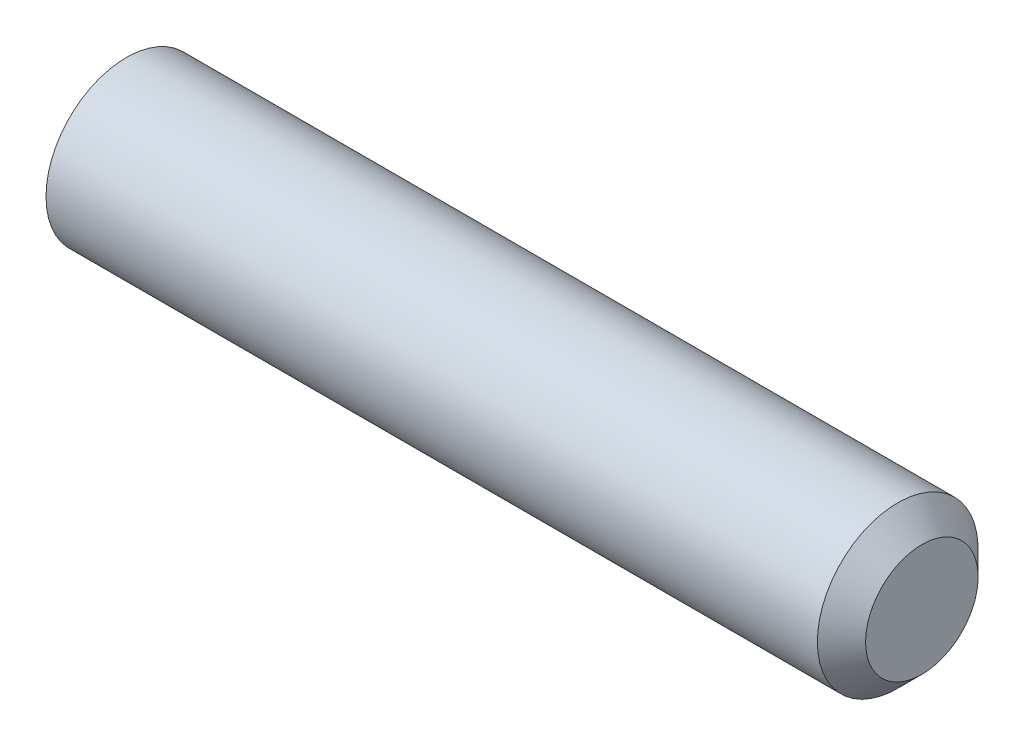
ISO-10303-21;
HEADER;
FILE_DESCRIPTION(('STEP AP214'),'2;1');
FILE_NAME('part.step','',(''),(''),'','','');
FILE_SCHEMA(('AUTOMOTIVE_DESIGN { 1 0 10303 214 1 1 1 1 }'));
ENDSEC;
DATA;
#1=APPLICATION_CONTEXT('core data for automotive mechanical design processes');
#2=APPLICATION_PROTOCOL_DEFINITION('international standard','automotive_design',2000,#1);
#3=PRODUCT_CONTEXT('',#1,'mechanical');
#4=PRODUCT('Part','Part','',(#3));
#5=PRODUCT_RELATED_PRODUCT_CATEGORY('part','',(#4));
#6=PRODUCT_DEFINITION_FORMATION('','',#4);
#7=PRODUCT_DEFINITION_CONTEXT('part definition',#1,'design');
#8=PRODUCT_DEFINITION('design','',#6,#7);
#9=PRODUCT_DEFINITION_SHAPE('','',#8);
#10=(LENGTH_UNIT() NAMED_UNIT(*) SI_UNIT(.MILLI.,.METRE.));
#11=(NAMED_UNIT(*) PLANE_ANGLE_UNIT() SI_UNIT($,.RADIAN.));
#12=(NAMED_UNIT(*) SI_UNIT($,.STERADIAN.) SOLID_ANGLE_UNIT());
#13=UNCERTAINTY_MEASURE_WITH_UNIT(LENGTH_MEASURE(1.E-05),#10,'distance_accuracy_value','');
#14=(GEOMETRIC_REPRESENTATION_CONTEXT(3) GLOBAL_UNCERTAINTY_ASSIGNED_CONTEXT((#13)) GLOBAL_UNIT_ASSIGNED_CONTEXT((#10,
#11,#12)) REPRESENTATION_CONTEXT('',''));
#15=CARTESIAN_POINT('',(0.,0.,0.));
#16=DIRECTION('',(0.,0.,1.));
#17=DIRECTION('',(1.,0.,0.));
#18=AXIS2_PLACEMENT_3D('',#15,#16,#17);
#19=CARTESIAN_POINT('',(25.,1.75,0.));
#20=DIRECTION('',(1.,0.,0.));
#21=DIRECTION('',(0.,0.,-1.));
#22=AXIS2_PLACEMENT_3D('',#19,#20,#21);
#23=PLANE('',#22);
#24=CARTESIAN_POINT('',(25.,0.,0.));
#25=DIRECTION('',(-1.,0.,0.));
#26=DIRECTION('',(0.,0.,1.));
#27=AXIS2_PLACEMENT_3D('',#24,#25,#26);
#28=CIRCLE('',#27,1.75);
#29=CARTESIAN_POINT('',(25.,0.,1.75));
#30=VERTEX_POINT('',#29);
#31=EDGE_CURVE('E10',#30,#30,#28,.T.);
#32=ORIENTED_EDGE('',*,*,#31,.F.);
#33=EDGE_LOOP('',(#32));
#34=FACE_BOUND('',#33,.T.);
#35=ADVANCED_FACE('F29',(#34),#23,.T.);
#36=CARTESIAN_POINT('',(24.25,0.,0.));
#37=DIRECTION('',(-1.,0.,0.));
#38=DIRECTION('',(0.,0.,1.));
#39=AXIS2_PLACEMENT_3D('',#36,#37,#38);
#40=CONICAL_SURFACE('',#39,2.5,0.785398163397476);
#41=ORIENTED_EDGE('',*,*,#31,.T.);
#42=EDGE_LOOP('',(#41));
#43=FACE_BOUND('',#42,.T.);
#44=CARTESIAN_POINT('',(24.25,0.,0.));
#45=DIRECTION('',(-1.,0.,0.));
#46=DIRECTION('',(0.,0.,1.));
#47=AXIS2_PLACEMENT_3D('',#44,#45,#46);
#48=CIRCLE('',#47,2.5);
#49=CARTESIAN_POINT('',(24.25,0.,2.5));
#50=VERTEX_POINT('',#49);
#51=EDGE_CURVE('E35',#50,#50,#48,.T.);
#52=ORIENTED_EDGE('',*,*,#51,.F.);
#53=EDGE_LOOP('',(#52));
#54=FACE_BOUND('',#53,.T.);
#55=ADVANCED_FACE('F61',(#43,#54),#40,.T.);
#56=CARTESIAN_POINT('',(-12.7,0.,0.));
#57=DIRECTION('',(-1.,0.,0.));
#58=DIRECTION('',(0.,0.,1.));
#59=AXIS2_PLACEMENT_3D('',#56,#57,#58);
#60=CYLINDRICAL_SURFACE('',#59,2.5);
#61=ORIENTED_EDGE('',*,*,#51,.T.);
#62=EDGE_LOOP('',(#61));
#63=FACE_BOUND('',#62,.T.);
#64=CARTESIAN_POINT('',(0.256920869789382,0.,0.));
#65=DIRECTION('',(-1.,0.,0.));
#66=DIRECTION('',(0.,0.,1.));
#67=AXIS2_PLACEMENT_3D('',#64,#65,#66);
#68=CIRCLE('',#67,2.5);
#69=CARTESIAN_POINT('',(0.256920869789382,0.,2.5));
#70=VERTEX_POINT('',#69);
#71=EDGE_CURVE('E39',#70,#70,#68,.T.);
#72=ORIENTED_EDGE('',*,*,#71,.F.);
#73=EDGE_LOOP('',(#72));
#74=FACE_BOUND('',#73,.T.);
#75=ADVANCED_FACE('F53',(#63,#74),#60,.T.);
#76=CARTESIAN_POINT('',(0.,0.,0.));
#77=DIRECTION('',(1.,0.,0.));
#78=DIRECTION('',(0.,0.,-1.));
#79=AXIS2_PLACEMENT_3D('',#76,#77,#78);
#80=CONICAL_SURFACE('',#79,2.055,1.0471975511966);
#81=ORIENTED_EDGE('',*,*,#71,.T.);
#82=EDGE_LOOP('',(#81));
#83=FACE_BOUND('',#82,.T.);
#84=CARTESIAN_POINT('',(0.,0.,0.));
#85=DIRECTION('',(-1.,0.,0.));
#86=DIRECTION('',(0.,0.,1.));
#87=AXIS2_PLACEMENT_3D('',#84,#85,#86);
#88=CIRCLE('',#87,2.055);
#89=CARTESIAN_POINT('',(0.,0.,2.055));
#90=VERTEX_POINT('',#89);
#91=EDGE_CURVE('E43',#90,#90,#88,.T.);
#92=ORIENTED_EDGE('',*,*,#91,.F.);
#93=EDGE_LOOP('',(#92));
#94=FACE_BOUND('',#93,.T.);
#95=ADVANCED_FACE('F51',(#83,#94),#80,.T.);
#96=CARTESIAN_POINT('',(0.,0.,0.));
#97=DIRECTION('',(-1.,0.,0.));
#98=DIRECTION('',(0.,0.,1.));
#99=AXIS2_PLACEMENT_3D('',#96,#97,#98);
#100=PLANE('',#99);
#101=ORIENTED_EDGE('',*,*,#91,.T.);
#102=EDGE_LOOP('',(#101));
#103=FACE_BOUND('',#102,.T.);
#104=ADVANCED_FACE('F49',(#103),#100,.T.);
#105=CLOSED_SHELL('',(#35,#55,#75,#95,#104));
#106=MANIFOLD_SOLID_BREP('B2',#105);
#107=ADVANCED_BREP_SHAPE_REPRESENTATION('',(#18,#106),#14);
#108=SHAPE_DEFINITION_REPRESENTATION(#9,#107);
ENDSEC;
END-ISO-10303-21;
